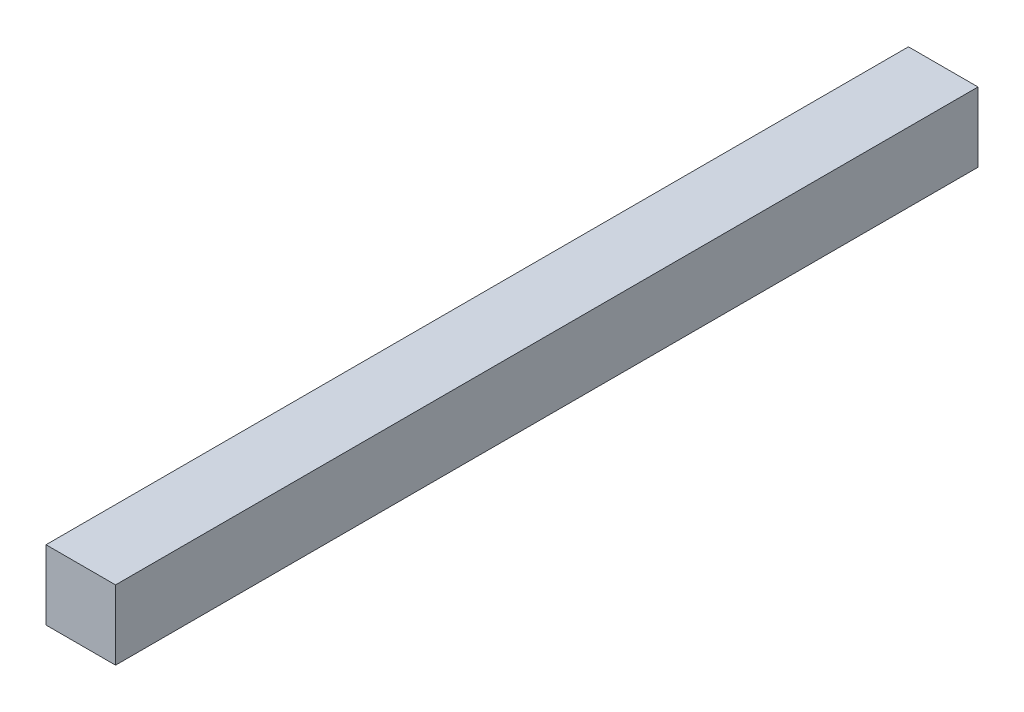
ISO-10303-21;
HEADER;
FILE_DESCRIPTION(('STEP AP214'),'2;1');
FILE_NAME('part.step','',(''),(''),'','','');
FILE_SCHEMA(('AUTOMOTIVE_DESIGN { 1 0 10303 214 1 1 1 1 }'));
ENDSEC;
DATA;
#1=APPLICATION_CONTEXT('core data for automotive mechanical design processes');
#2=APPLICATION_PROTOCOL_DEFINITION('international standard','automotive_design',2000,#1);
#3=PRODUCT_CONTEXT('',#1,'mechanical');
#4=PRODUCT('Part','Part','',(#3));
#5=PRODUCT_RELATED_PRODUCT_CATEGORY('part','',(#4));
#6=PRODUCT_DEFINITION_FORMATION('','',#4);
#7=PRODUCT_DEFINITION_CONTEXT('part definition',#1,'design');
#8=PRODUCT_DEFINITION('design','',#6,#7);
#9=PRODUCT_DEFINITION_SHAPE('','',#8);
#10=(LENGTH_UNIT() NAMED_UNIT(*) SI_UNIT(.MILLI.,.METRE.));
#11=(NAMED_UNIT(*) PLANE_ANGLE_UNIT() SI_UNIT($,.RADIAN.));
#12=(NAMED_UNIT(*) SI_UNIT($,.STERADIAN.) SOLID_ANGLE_UNIT());
#13=UNCERTAINTY_MEASURE_WITH_UNIT(LENGTH_MEASURE(1.E-05),#10,'distance_accuracy_value','');
#14=(GEOMETRIC_REPRESENTATION_CONTEXT(3) GLOBAL_UNCERTAINTY_ASSIGNED_CONTEXT((#13)) GLOBAL_UNIT_ASSIGNED_CONTEXT((#10,
#11,#12)) REPRESENTATION_CONTEXT('',''));
#15=CARTESIAN_POINT('',(0.,0.,0.));
#16=DIRECTION('',(0.,0.,1.));
#17=DIRECTION('',(1.,0.,0.));
#18=AXIS2_PLACEMENT_3D('',#15,#16,#17);
#19=CARTESIAN_POINT('',(-11.4887558523294,4.28960396039604,62.));
#20=DIRECTION('',(1.,0.,0.));
#21=DIRECTION('',(0.,0.,-1.));
#22=AXIS2_PLACEMENT_3D('',#19,#20,#21);
#23=PLANE('',#22);
#24=DIRECTION('',(0.,-1.,0.));
#25=VECTOR('',#24,1.);
#26=CARTESIAN_POINT('',(-11.4887558523294,4.28960396039604,0.));
#27=LINE('',#26,#25);
#28=CARTESIAN_POINT('',(-11.4887558523294,4.28960396039604,0.));
#29=VERTEX_POINT('',#28);
#30=CARTESIAN_POINT('',(-11.4887558523294,-0.71039603960396,0.));
#31=VERTEX_POINT('',#30);
#32=EDGE_CURVE('E107',#29,#31,#27,.T.);
#33=ORIENTED_EDGE('',*,*,#32,.T.);
#34=DIRECTION('',(0.,0.,-1.));
#35=VECTOR('',#34,1.);
#36=CARTESIAN_POINT('',(-11.4887558523294,-0.71039603960396,62.));
#37=LINE('',#36,#35);
#38=CARTESIAN_POINT('',(-11.4887558523294,-0.71039603960396,62.));
#39=VERTEX_POINT('',#38);
#40=EDGE_CURVE('E11',#39,#31,#37,.T.);
#41=ORIENTED_EDGE('',*,*,#40,.F.);
#42=DIRECTION('',(0.,-1.,0.));
#43=VECTOR('',#42,1.);
#44=CARTESIAN_POINT('',(-11.4887558523294,4.28960396039604,62.));
#45=LINE('',#44,#43);
#46=CARTESIAN_POINT('',(-11.4887558523294,4.28960396039604,62.));
#47=VERTEX_POINT('',#46);
#48=EDGE_CURVE('E91',#47,#39,#45,.T.);
#49=ORIENTED_EDGE('',*,*,#48,.F.);
#50=DIRECTION('',(0.,0.,-1.));
#51=VECTOR('',#50,1.);
#52=CARTESIAN_POINT('',(-11.4887558523294,4.28960396039604,62.));
#53=LINE('',#52,#51);
#54=EDGE_CURVE('E103',#47,#29,#53,.T.);
#55=ORIENTED_EDGE('',*,*,#54,.T.);
#56=EDGE_LOOP('',(#33,#41,#49,#55));
#57=FACE_BOUND('',#56,.T.);
#58=ADVANCED_FACE('F39',(#57),#23,.F.);
#59=CARTESIAN_POINT('',(-11.4887558523294,-0.71039603960396,62.));
#60=DIRECTION('',(0.,1.,0.));
#61=DIRECTION('',(0.,0.,1.));
#62=AXIS2_PLACEMENT_3D('',#59,#60,#61);
#63=PLANE('',#62);
#64=DIRECTION('',(1.,0.,0.));
#65=VECTOR('',#64,1.);
#66=CARTESIAN_POINT('',(-11.4887558523294,-0.71039603960396,0.));
#67=LINE('',#66,#65);
#68=CARTESIAN_POINT('',(-6.48875585232941,-0.71039603960396,0.));
#69=VERTEX_POINT('',#68);
#70=EDGE_CURVE('E96',#31,#69,#67,.T.);
#71=ORIENTED_EDGE('',*,*,#70,.T.);
#72=DIRECTION('',(0.,0.,-1.));
#73=VECTOR('',#72,1.);
#74=CARTESIAN_POINT('',(-6.48875585232941,-0.71039603960396,62.));
#75=LINE('',#74,#73);
#76=CARTESIAN_POINT('',(-6.48875585232941,-0.71039603960396,62.));
#77=VERTEX_POINT('',#76);
#78=EDGE_CURVE('E48',#77,#69,#75,.T.);
#79=ORIENTED_EDGE('',*,*,#78,.F.);
#80=DIRECTION('',(1.,0.,0.));
#81=VECTOR('',#80,1.);
#82=CARTESIAN_POINT('',(-11.4887558523294,-0.71039603960396,62.));
#83=LINE('',#82,#81);
#84=EDGE_CURVE('E86',#39,#77,#83,.T.);
#85=ORIENTED_EDGE('',*,*,#84,.F.);
#86=ORIENTED_EDGE('',*,*,#40,.T.);
#87=EDGE_LOOP('',(#71,#79,#85,#86));
#88=FACE_BOUND('',#87,.T.);
#89=ADVANCED_FACE('F95',(#88),#63,.F.);
#90=CARTESIAN_POINT('',(-6.48875585232941,4.28960396039604,62.));
#91=DIRECTION('',(-1.,0.,0.));
#92=DIRECTION('',(0.,0.,1.));
#93=AXIS2_PLACEMENT_3D('',#90,#91,#92);
#94=PLANE('',#93);
#95=DIRECTION('',(0.,1.,0.));
#96=VECTOR('',#95,1.);
#97=CARTESIAN_POINT('',(-6.48875585232941,4.28960396039604,0.));
#98=LINE('',#97,#96);
#99=CARTESIAN_POINT('',(-6.48875585232941,4.28960396039604,0.));
#100=VERTEX_POINT('',#99);
#101=EDGE_CURVE('E73',#69,#100,#98,.T.);
#102=ORIENTED_EDGE('',*,*,#101,.T.);
#103=DIRECTION('',(0.,0.,-1.));
#104=VECTOR('',#103,1.);
#105=CARTESIAN_POINT('',(-6.48875585232941,4.28960396039604,62.));
#106=LINE('',#105,#104);
#107=CARTESIAN_POINT('',(-6.48875585232941,4.28960396039604,62.));
#108=VERTEX_POINT('',#107);
#109=EDGE_CURVE('E98',#108,#100,#106,.T.);
#110=ORIENTED_EDGE('',*,*,#109,.F.);
#111=DIRECTION('',(0.,1.,0.));
#112=VECTOR('',#111,1.);
#113=CARTESIAN_POINT('',(-6.48875585232941,4.28960396039604,62.));
#114=LINE('',#113,#112);
#115=EDGE_CURVE('E89',#77,#108,#114,.T.);
#116=ORIENTED_EDGE('',*,*,#115,.F.);
#117=ORIENTED_EDGE('',*,*,#78,.T.);
#118=EDGE_LOOP('',(#102,#110,#116,#117));
#119=FACE_BOUND('',#118,.T.);
#120=ADVANCED_FACE('F99',(#119),#94,.F.);
#121=CARTESIAN_POINT('',(-11.4887558523294,4.28960396039604,62.));
#122=DIRECTION('',(0.,-1.,0.));
#123=DIRECTION('',(0.,0.,-1.));
#124=AXIS2_PLACEMENT_3D('',#121,#122,#123);
#125=PLANE('',#124);
#126=DIRECTION('',(-1.,0.,0.));
#127=VECTOR('',#126,1.);
#128=CARTESIAN_POINT('',(-11.4887558523294,4.28960396039604,0.));
#129=LINE('',#128,#127);
#130=EDGE_CURVE('E79',#100,#29,#129,.T.);
#131=ORIENTED_EDGE('',*,*,#130,.T.);
#132=ORIENTED_EDGE('',*,*,#54,.F.);
#133=DIRECTION('',(-1.,0.,0.));
#134=VECTOR('',#133,1.);
#135=CARTESIAN_POINT('',(-11.4887558523294,4.28960396039604,62.));
#136=LINE('',#135,#134);
#137=EDGE_CURVE('E56',#108,#47,#136,.T.);
#138=ORIENTED_EDGE('',*,*,#137,.F.);
#139=ORIENTED_EDGE('',*,*,#109,.T.);
#140=EDGE_LOOP('',(#131,#132,#138,#139));
#141=FACE_BOUND('',#140,.T.);
#142=ADVANCED_FACE('F120',(#141),#125,.F.);
#143=CARTESIAN_POINT('',(0.,0.,62.));
#144=DIRECTION('',(0.,0.,1.));
#145=DIRECTION('',(1.,0.,0.));
#146=AXIS2_PLACEMENT_3D('',#143,#144,#145);
#147=PLANE('',#146);
#148=ORIENTED_EDGE('',*,*,#48,.T.);
#149=ORIENTED_EDGE('',*,*,#84,.T.);
#150=ORIENTED_EDGE('',*,*,#115,.T.);
#151=ORIENTED_EDGE('',*,*,#137,.T.);
#152=EDGE_LOOP('',(#148,#149,#150,#151));
#153=FACE_BOUND('',#152,.T.);
#154=ADVANCED_FACE('F87',(#153),#147,.T.);
#155=CARTESIAN_POINT('',(0.,0.,0.));
#156=DIRECTION('',(0.,0.,1.));
#157=DIRECTION('',(1.,0.,0.));
#158=AXIS2_PLACEMENT_3D('',#155,#156,#157);
#159=PLANE('',#158);
#160=ORIENTED_EDGE('',*,*,#32,.F.);
#161=ORIENTED_EDGE('',*,*,#130,.F.);
#162=ORIENTED_EDGE('',*,*,#101,.F.);
#163=ORIENTED_EDGE('',*,*,#70,.F.);
#164=EDGE_LOOP('',(#160,#161,#162,#163));
#165=FACE_BOUND('',#164,.T.);
#166=ADVANCED_FACE('F123',(#165),#159,.F.);
#167=CLOSED_SHELL('',(#58,#89,#120,#142,#154,#166));
#168=MANIFOLD_SOLID_BREP('B2',#167);
#169=ADVANCED_BREP_SHAPE_REPRESENTATION('',(#18,#168),#14);
#170=SHAPE_DEFINITION_REPRESENTATION(#9,#169);
ENDSEC;
END-ISO-10303-21;
